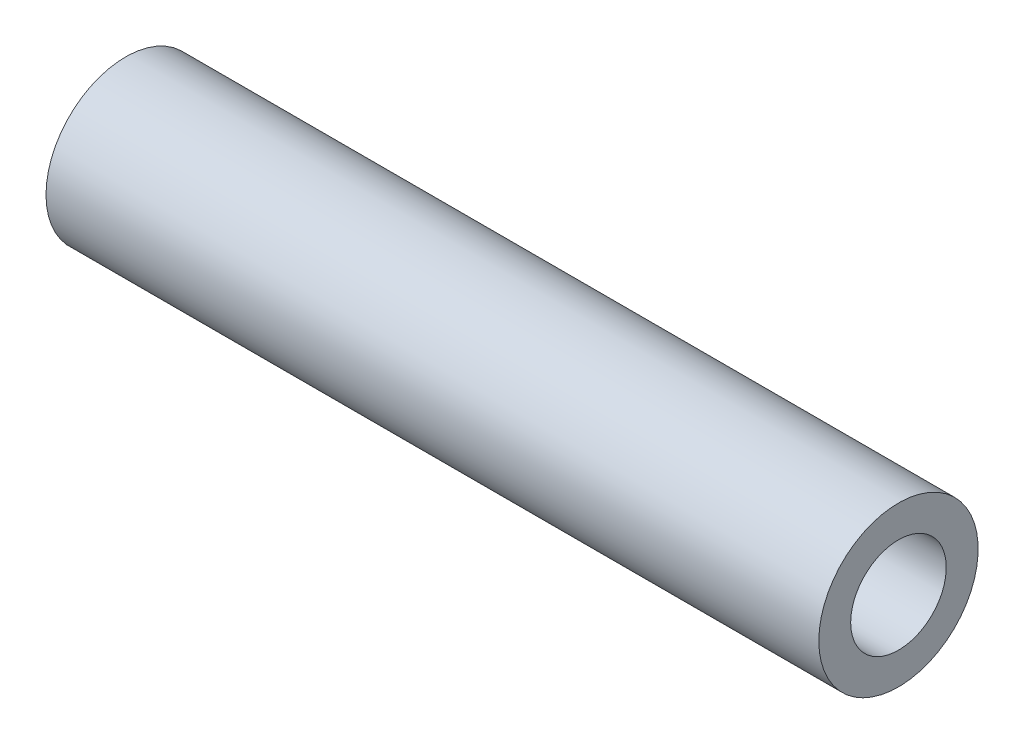
ISO-10303-21;
HEADER;
FILE_DESCRIPTION(('STEP AP214'),'2;1');
FILE_NAME('part.step','',(''),(''),'','','');
FILE_SCHEMA(('AUTOMOTIVE_DESIGN { 1 0 10303 214 1 1 1 1 }'));
ENDSEC;
DATA;
#1=APPLICATION_CONTEXT('core data for automotive mechanical design processes');
#2=APPLICATION_PROTOCOL_DEFINITION('international standard','automotive_design',2000,#1);
#3=PRODUCT_CONTEXT('',#1,'mechanical');
#4=PRODUCT('Part','Part','',(#3));
#5=PRODUCT_RELATED_PRODUCT_CATEGORY('part','',(#4));
#6=PRODUCT_DEFINITION_FORMATION('','',#4);
#7=PRODUCT_DEFINITION_CONTEXT('part definition',#1,'design');
#8=PRODUCT_DEFINITION('design','',#6,#7);
#9=PRODUCT_DEFINITION_SHAPE('','',#8);
#10=(LENGTH_UNIT() NAMED_UNIT(*) SI_UNIT(.MILLI.,.METRE.));
#11=(NAMED_UNIT(*) PLANE_ANGLE_UNIT() SI_UNIT($,.RADIAN.));
#12=(NAMED_UNIT(*) SI_UNIT($,.STERADIAN.) SOLID_ANGLE_UNIT());
#13=UNCERTAINTY_MEASURE_WITH_UNIT(LENGTH_MEASURE(1.E-05),#10,'distance_accuracy_value','');
#14=(GEOMETRIC_REPRESENTATION_CONTEXT(3) GLOBAL_UNCERTAINTY_ASSIGNED_CONTEXT((#13)) GLOBAL_UNIT_ASSIGNED_CONTEXT((#10,
#11,#12)) REPRESENTATION_CONTEXT('',''));
#15=CARTESIAN_POINT('',(0.,0.,0.));
#16=DIRECTION('',(0.,0.,1.));
#17=DIRECTION('',(1.,0.,0.));
#18=AXIS2_PLACEMENT_3D('',#15,#16,#17);
#19=CARTESIAN_POINT('',(-22.7210678117726,50.7926102412627,15.5819357775636));
#20=DIRECTION('',(1.,0.,0.));
#21=DIRECTION('',(0.,0.,-1.));
#22=AXIS2_PLACEMENT_3D('',#19,#20,#21);
#23=CYLINDRICAL_SURFACE('',#22,2.49999999996715);
#24=CARTESIAN_POINT('',(8.59999999999987,50.7926102412627,15.5819357775636));
#25=DIRECTION('',(-1.,0.,0.));
#26=DIRECTION('',(0.,0.,1.));
#27=AXIS2_PLACEMENT_3D('',#24,#25,#26);
#28=CIRCLE('',#27,2.49999999996715);
#29=CARTESIAN_POINT('',(8.59999999999987,50.7926102412627,18.0819357775308));
#30=VERTEX_POINT('',#29);
#31=EDGE_CURVE('E40',#30,#30,#28,.T.);
#32=ORIENTED_EDGE('',*,*,#31,.T.);
#33=EDGE_LOOP('',(#32));
#34=FACE_BOUND('',#33,.T.);
#35=CARTESIAN_POINT('',(-15.6500000000001,50.7926102412627,15.5819357775636));
#36=DIRECTION('',(-1.,0.,0.));
#37=DIRECTION('',(0.,0.,1.));
#38=AXIS2_PLACEMENT_3D('',#35,#36,#37);
#39=CIRCLE('',#38,2.49999999996715);
#40=CARTESIAN_POINT('',(-15.6500000000001,50.7926102412627,18.0819357775308));
#41=VERTEX_POINT('',#40);
#42=EDGE_CURVE('E10',#41,#41,#39,.T.);
#43=ORIENTED_EDGE('',*,*,#42,.F.);
#44=EDGE_LOOP('',(#43));
#45=FACE_BOUND('',#44,.T.);
#46=ADVANCED_FACE('F37',(#34,#45),#23,.T.);
#47=CARTESIAN_POINT('',(8.59999999999987,50.7926102412627,15.5819357775636));
#48=DIRECTION('',(-1.,0.,0.));
#49=DIRECTION('',(0.,0.,1.));
#50=AXIS2_PLACEMENT_3D('',#47,#48,#49);
#51=PLANE('',#50);
#52=ORIENTED_EDGE('',*,*,#31,.F.);
#53=EDGE_LOOP('',(#52));
#54=FACE_BOUND('',#53,.T.);
#55=CARTESIAN_POINT('',(8.59999999999987,50.7926102412627,15.5819357775636));
#56=DIRECTION('',(-1.,0.,0.));
#57=DIRECTION('',(0.,0.,1.));
#58=AXIS2_PLACEMENT_3D('',#55,#56,#57);
#59=CIRCLE('',#58,1.49999999996771);
#60=CARTESIAN_POINT('',(8.59999999999987,50.7926102412627,17.0819357775313));
#61=VERTEX_POINT('',#60);
#62=EDGE_CURVE('E50',#61,#61,#59,.T.);
#63=ORIENTED_EDGE('',*,*,#62,.T.);
#64=EDGE_LOOP('',(#63));
#65=FACE_BOUND('',#64,.T.);
#66=ADVANCED_FACE('F59',(#54,#65),#51,.F.);
#67=CARTESIAN_POINT('',(-22.7210678117726,50.7926102412627,15.5819357775636));
#68=DIRECTION('',(1.,0.,0.));
#69=DIRECTION('',(0.,0.,-1.));
#70=AXIS2_PLACEMENT_3D('',#67,#68,#69);
#71=CYLINDRICAL_SURFACE('',#70,1.49999999996771);
#72=ORIENTED_EDGE('',*,*,#62,.F.);
#73=EDGE_LOOP('',(#72));
#74=FACE_BOUND('',#73,.T.);
#75=CARTESIAN_POINT('',(-15.6500000000001,50.7926102412627,15.5819357775636));
#76=DIRECTION('',(-1.,0.,0.));
#77=DIRECTION('',(0.,0.79613199747414,-0.605122997908554));
#78=AXIS2_PLACEMENT_3D('',#75,#76,#77);
#79=CIRCLE('',#78,1.499999999996);
#80=CARTESIAN_POINT('',(-15.6500000000001,51.9868082374707,14.6742512807032));
#81=VERTEX_POINT('',#80);
#82=EDGE_CURVE('E44',#81,#81,#79,.T.);
#83=ORIENTED_EDGE('',*,*,#82,.T.);
#84=EDGE_LOOP('',(#83));
#85=FACE_BOUND('',#84,.T.);
#86=ADVANCED_FACE('F61',(#74,#85),#71,.F.);
#87=CARTESIAN_POINT('',(-15.6500000000001,29.9661194266305,24.0970564665521));
#88=DIRECTION('',(-1.,0.,0.));
#89=DIRECTION('',(0.,-0.79613199747414,0.605122997908554));
#90=AXIS2_PLACEMENT_3D('',#87,#88,#89);
#91=PLANE('',#90);
#92=ORIENTED_EDGE('',*,*,#82,.F.);
#93=EDGE_LOOP('',(#92));
#94=FACE_BOUND('',#93,.T.);
#95=ORIENTED_EDGE('',*,*,#42,.T.);
#96=EDGE_LOOP('',(#95));
#97=FACE_BOUND('',#96,.T.);
#98=ADVANCED_FACE('F66',(#94,#97),#91,.T.);
#99=CLOSED_SHELL('',(#46,#66,#86,#98));
#100=MANIFOLD_SOLID_BREP('B2',#99);
#101=ADVANCED_BREP_SHAPE_REPRESENTATION('',(#18,#100),#14);
#102=SHAPE_DEFINITION_REPRESENTATION(#9,#101);
ENDSEC;
END-ISO-10303-21;
